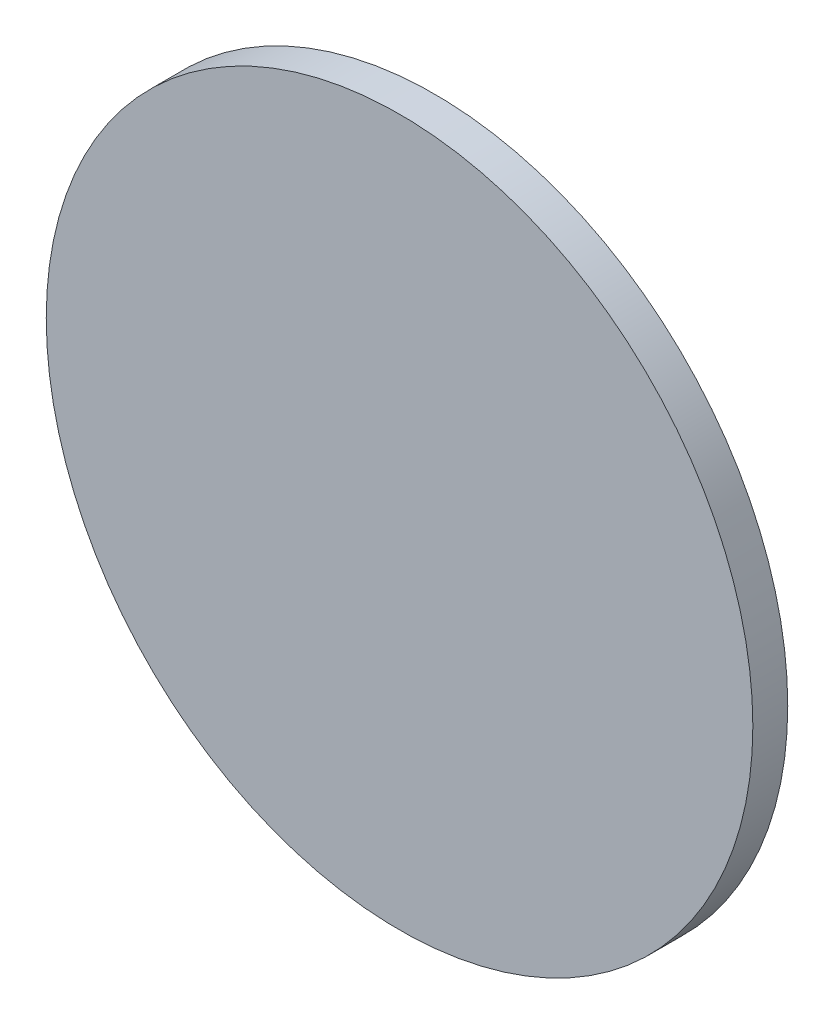
ISO-10303-21;
HEADER;
FILE_DESCRIPTION(('STEP AP214'),'2;1');
FILE_NAME('part.step','',(''),(''),'','','');
FILE_SCHEMA(('AUTOMOTIVE_DESIGN { 1 0 10303 214 1 1 1 1 }'));
ENDSEC;
DATA;
#1=APPLICATION_CONTEXT('core data for automotive mechanical design processes');
#2=APPLICATION_PROTOCOL_DEFINITION('international standard','automotive_design',2000,#1);
#3=PRODUCT_CONTEXT('',#1,'mechanical');
#4=PRODUCT('Part','Part','',(#3));
#5=PRODUCT_RELATED_PRODUCT_CATEGORY('part','',(#4));
#6=PRODUCT_DEFINITION_FORMATION('','',#4);
#7=PRODUCT_DEFINITION_CONTEXT('part definition',#1,'design');
#8=PRODUCT_DEFINITION('design','',#6,#7);
#9=PRODUCT_DEFINITION_SHAPE('','',#8);
#10=(LENGTH_UNIT() NAMED_UNIT(*) SI_UNIT(.MILLI.,.METRE.));
#11=(NAMED_UNIT(*) PLANE_ANGLE_UNIT() SI_UNIT($,.RADIAN.));
#12=(NAMED_UNIT(*) SI_UNIT($,.STERADIAN.) SOLID_ANGLE_UNIT());
#13=UNCERTAINTY_MEASURE_WITH_UNIT(LENGTH_MEASURE(1.E-05),#10,'distance_accuracy_value','');
#14=(GEOMETRIC_REPRESENTATION_CONTEXT(3) GLOBAL_UNCERTAINTY_ASSIGNED_CONTEXT((#13)) GLOBAL_UNIT_ASSIGNED_CONTEXT((#10,
#11,#12)) REPRESENTATION_CONTEXT('',''));
#15=CARTESIAN_POINT('',(0.,0.,0.));
#16=DIRECTION('',(0.,0.,1.));
#17=DIRECTION('',(1.,0.,0.));
#18=AXIS2_PLACEMENT_3D('',#15,#16,#17);
#19=CARTESIAN_POINT('',(0.,0.,1.6764));
#20=DIRECTION('',(0.,0.,-1.));
#21=DIRECTION('',(-1.,0.,0.));
#22=AXIS2_PLACEMENT_3D('',#19,#20,#21);
#23=CYLINDRICAL_SURFACE('',#22,16.9672);
#24=CARTESIAN_POINT('',(0.,0.,1.6764));
#25=DIRECTION('',(0.,0.,1.));
#26=DIRECTION('',(1.,0.,0.));
#27=AXIS2_PLACEMENT_3D('',#24,#25,#26);
#28=CIRCLE('',#27,16.9672);
#29=CARTESIAN_POINT('',(16.9672,0.,1.6764));
#30=VERTEX_POINT('',#29);
#31=EDGE_CURVE('E10',#30,#30,#28,.T.);
#32=ORIENTED_EDGE('',*,*,#31,.F.);
#33=EDGE_LOOP('',(#32));
#34=FACE_BOUND('',#33,.T.);
#35=CARTESIAN_POINT('',(0.,0.,0.));
#36=DIRECTION('',(0.,0.,1.));
#37=DIRECTION('',(1.,0.,0.));
#38=AXIS2_PLACEMENT_3D('',#35,#36,#37);
#39=CIRCLE('',#38,16.9672);
#40=CARTESIAN_POINT('',(16.9672,0.,0.));
#41=VERTEX_POINT('',#40);
#42=EDGE_CURVE('E33',#41,#41,#39,.T.);
#43=ORIENTED_EDGE('',*,*,#42,.T.);
#44=EDGE_LOOP('',(#43));
#45=FACE_BOUND('',#44,.T.);
#46=ADVANCED_FACE('F30',(#34,#45),#23,.T.);
#47=CARTESIAN_POINT('',(0.,0.,1.6764));
#48=DIRECTION('',(0.,0.,1.));
#49=DIRECTION('',(1.,0.,0.));
#50=AXIS2_PLACEMENT_3D('',#47,#48,#49);
#51=PLANE('',#50);
#52=ORIENTED_EDGE('',*,*,#31,.T.);
#53=EDGE_LOOP('',(#52));
#54=FACE_BOUND('',#53,.T.);
#55=ADVANCED_FACE('F45',(#54),#51,.T.);
#56=CARTESIAN_POINT('',(0.,0.,0.));
#57=DIRECTION('',(0.,0.,1.));
#58=DIRECTION('',(1.,0.,0.));
#59=AXIS2_PLACEMENT_3D('',#56,#57,#58);
#60=PLANE('',#59);
#61=ORIENTED_EDGE('',*,*,#42,.F.);
#62=EDGE_LOOP('',(#61));
#63=FACE_BOUND('',#62,.T.);
#64=ADVANCED_FACE('F43',(#63),#60,.F.);
#65=CLOSED_SHELL('',(#46,#55,#64));
#66=MANIFOLD_SOLID_BREP('B2',#65);
#67=ADVANCED_BREP_SHAPE_REPRESENTATION('',(#18,#66),#14);
#68=SHAPE_DEFINITION_REPRESENTATION(#9,#67);
ENDSEC;
END-ISO-10303-21;
